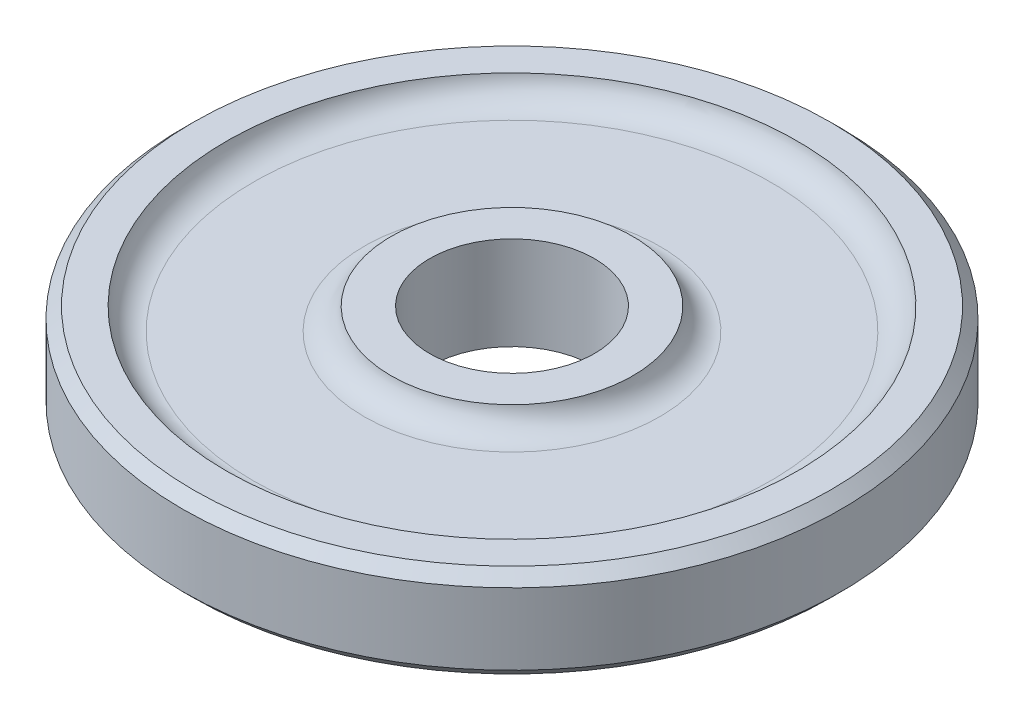
ISO-10303-21;
HEADER;
FILE_DESCRIPTION(('STEP AP214'),'2;1');
FILE_NAME('part.step','',(''),(''),'','','');
FILE_SCHEMA(('AUTOMOTIVE_DESIGN { 1 0 10303 214 1 1 1 1 }'));
ENDSEC;
DATA;
#1=APPLICATION_CONTEXT('core data for automotive mechanical design processes');
#2=APPLICATION_PROTOCOL_DEFINITION('international standard','automotive_design',2000,#1);
#3=PRODUCT_CONTEXT('',#1,'mechanical');
#4=PRODUCT('Part','Part','',(#3));
#5=PRODUCT_RELATED_PRODUCT_CATEGORY('part','',(#4));
#6=PRODUCT_DEFINITION_FORMATION('','',#4);
#7=PRODUCT_DEFINITION_CONTEXT('part definition',#1,'design');
#8=PRODUCT_DEFINITION('design','',#6,#7);
#9=PRODUCT_DEFINITION_SHAPE('','',#8);
#10=(LENGTH_UNIT() NAMED_UNIT(*) SI_UNIT(.MILLI.,.METRE.));
#11=(NAMED_UNIT(*) PLANE_ANGLE_UNIT() SI_UNIT($,.RADIAN.));
#12=(NAMED_UNIT(*) SI_UNIT($,.STERADIAN.) SOLID_ANGLE_UNIT());
#13=UNCERTAINTY_MEASURE_WITH_UNIT(LENGTH_MEASURE(1.E-05),#10,'distance_accuracy_value','');
#14=(GEOMETRIC_REPRESENTATION_CONTEXT(3) GLOBAL_UNCERTAINTY_ASSIGNED_CONTEXT((#13)) GLOBAL_UNIT_ASSIGNED_CONTEXT((#10,
#11,#12)) REPRESENTATION_CONTEXT('',''));
#15=CARTESIAN_POINT('',(0.,0.,0.));
#16=DIRECTION('',(0.,0.,1.));
#17=DIRECTION('',(1.,0.,0.));
#18=AXIS2_PLACEMENT_3D('',#15,#16,#17);
#19=CARTESIAN_POINT('',(0.,17.,0.));
#20=DIRECTION('',(0.,-1.,0.));
#21=DIRECTION('',(0.,0.,-1.));
#22=AXIS2_PLACEMENT_3D('',#19,#20,#21);
#23=CYLINDRICAL_SURFACE('',#22,60.);
#24=CARTESIAN_POINT('',(0.,1.99999999999999,0.));
#25=DIRECTION('',(0.,1.,0.));
#26=DIRECTION('',(0.,0.,1.));
#27=AXIS2_PLACEMENT_3D('',#24,#25,#26);
#28=CIRCLE('',#27,60.);
#29=CARTESIAN_POINT('',(0.,1.99999999999999,60.));
#30=VERTEX_POINT('',#29);
#31=EDGE_CURVE('E41',#30,#30,#28,.T.);
#32=ORIENTED_EDGE('',*,*,#31,.T.);
#33=EDGE_LOOP('',(#32));
#34=FACE_BOUND('',#33,.T.);
#35=CARTESIAN_POINT('',(0.,15.,0.));
#36=DIRECTION('',(0.,1.,0.));
#37=DIRECTION('',(0.,0.,1.));
#38=AXIS2_PLACEMENT_3D('',#35,#36,#37);
#39=CIRCLE('',#38,60.);
#40=CARTESIAN_POINT('',(0.,15.,60.));
#41=VERTEX_POINT('',#40);
#42=EDGE_CURVE('E45',#41,#41,#39,.F.);
#43=ORIENTED_EDGE('',*,*,#42,.T.);
#44=EDGE_LOOP('',(#43));
#45=FACE_BOUND('',#44,.T.);
#46=ADVANCED_FACE('F30',(#34,#45),#23,.T.);
#47=CARTESIAN_POINT('',(0.,17.,0.));
#48=DIRECTION('',(0.,1.,0.));
#49=DIRECTION('',(0.,0.,1.));
#50=AXIS2_PLACEMENT_3D('',#47,#48,#49);
#51=PLANE('',#50);
#52=CARTESIAN_POINT('',(0.,17.,0.));
#53=DIRECTION('',(0.,1.,0.));
#54=DIRECTION('',(0.,0.,1.));
#55=AXIS2_PLACEMENT_3D('',#52,#53,#54);
#56=CIRCLE('',#55,58.);
#57=CARTESIAN_POINT('',(0.,17.,58.));
#58=VERTEX_POINT('',#57);
#59=EDGE_CURVE('E10',#58,#58,#56,.T.);
#60=ORIENTED_EDGE('',*,*,#59,.T.);
#61=EDGE_LOOP('',(#60));
#62=FACE_BOUND('',#61,.T.);
#63=CARTESIAN_POINT('',(0.,17.,0.));
#64=DIRECTION('',(0.,1.,0.));
#65=DIRECTION('',(0.,0.,1.));
#66=AXIS2_PLACEMENT_3D('',#63,#64,#65);
#67=CIRCLE('',#66,52.);
#68=CARTESIAN_POINT('',(0.,17.,52.));
#69=VERTEX_POINT('',#68);
#70=EDGE_CURVE('E62',#69,#69,#67,.T.);
#71=ORIENTED_EDGE('',*,*,#70,.F.);
#72=EDGE_LOOP('',(#71));
#73=FACE_BOUND('',#72,.T.);
#74=ADVANCED_FACE('F114',(#62,#73),#51,.T.);
#75=CARTESIAN_POINT('',(0.,0.,0.));
#76=DIRECTION('',(0.,1.,0.));
#77=DIRECTION('',(0.,0.,1.));
#78=AXIS2_PLACEMENT_3D('',#75,#76,#77);
#79=PLANE('',#78);
#80=CARTESIAN_POINT('',(0.,0.,0.));
#81=DIRECTION('',(0.,1.,0.));
#82=DIRECTION('',(0.,0.,1.));
#83=AXIS2_PLACEMENT_3D('',#80,#81,#82);
#84=CIRCLE('',#83,58.);
#85=CARTESIAN_POINT('',(0.,0.,58.));
#86=VERTEX_POINT('',#85);
#87=EDGE_CURVE('E37',#86,#86,#84,.F.);
#88=ORIENTED_EDGE('',*,*,#87,.T.);
#89=EDGE_LOOP('',(#88));
#90=FACE_BOUND('',#89,.T.);
#91=CARTESIAN_POINT('',(0.,0.,0.));
#92=DIRECTION('',(0.,1.,0.));
#93=DIRECTION('',(0.,0.,1.));
#94=AXIS2_PLACEMENT_3D('',#91,#92,#93);
#95=CIRCLE('',#94,52.);
#96=CARTESIAN_POINT('',(0.,0.,52.));
#97=VERTEX_POINT('',#96);
#98=EDGE_CURVE('E68',#97,#97,#95,.T.);
#99=ORIENTED_EDGE('',*,*,#98,.T.);
#100=EDGE_LOOP('',(#99));
#101=FACE_BOUND('',#100,.T.);
#102=ADVANCED_FACE('F96',(#90,#101),#79,.F.);
#103=CARTESIAN_POINT('',(0.,13.,0.));
#104=DIRECTION('',(0.,1.,0.));
#105=DIRECTION('',(0.,0.,1.));
#106=AXIS2_PLACEMENT_3D('',#103,#104,#105);
#107=PLANE('',#106);
#108=CARTESIAN_POINT('',(0.,13.,0.));
#109=DIRECTION('',(0.,1.,0.));
#110=DIRECTION('',(0.,0.,1.));
#111=AXIS2_PLACEMENT_3D('',#108,#109,#110);
#112=CIRCLE('',#111,26.8989794855664);
#113=CARTESIAN_POINT('',(0.,13.,26.8989794855664));
#114=VERTEX_POINT('',#113);
#115=EDGE_CURVE('E50',#114,#114,#112,.F.);
#116=ORIENTED_EDGE('',*,*,#115,.T.);
#117=EDGE_LOOP('',(#116));
#118=FACE_BOUND('',#117,.T.);
#119=CARTESIAN_POINT('',(0.,13.,0.));
#120=DIRECTION('',(0.,1.,0.));
#121=DIRECTION('',(0.,0.,1.));
#122=AXIS2_PLACEMENT_3D('',#119,#120,#121);
#123=CIRCLE('',#122,47.1010205144336);
#124=CARTESIAN_POINT('',(0.,13.,47.1010205144336));
#125=VERTEX_POINT('',#124);
#126=EDGE_CURVE('E53',#125,#125,#123,.T.);
#127=ORIENTED_EDGE('',*,*,#126,.T.);
#128=EDGE_LOOP('',(#127));
#129=FACE_BOUND('',#128,.T.);
#130=ADVANCED_FACE('F112',(#118,#129),#107,.T.);
#131=CARTESIAN_POINT('',(0.,17.,0.));
#132=DIRECTION('',(0.,-1.,0.));
#133=DIRECTION('',(0.,0.,-1.));
#134=AXIS2_PLACEMENT_3D('',#131,#132,#133);
#135=CIRCLE('',#134,15.);
#136=CARTESIAN_POINT('',(0.,17.,-15.));
#137=VERTEX_POINT('',#136);
#138=EDGE_CURVE('E74',#137,#137,#135,.T.);
#139=ORIENTED_EDGE('',*,*,#138,.T.);
#140=EDGE_LOOP('',(#139));
#141=FACE_BOUND('',#140,.T.);
#142=CARTESIAN_POINT('',(0.,17.,0.));
#143=DIRECTION('',(0.,1.,0.));
#144=DIRECTION('',(0.,0.,1.));
#145=AXIS2_PLACEMENT_3D('',#142,#143,#144);
#146=CIRCLE('',#145,22.);
#147=CARTESIAN_POINT('',(0.,17.,22.));
#148=VERTEX_POINT('',#147);
#149=EDGE_CURVE('E65',#148,#148,#146,.T.);
#150=ORIENTED_EDGE('',*,*,#149,.T.);
#151=EDGE_LOOP('',(#150));
#152=FACE_BOUND('',#151,.T.);
#153=ADVANCED_FACE('F81',(#141,#152),#51,.T.);
#154=CARTESIAN_POINT('',(0.,4.,0.));
#155=DIRECTION('',(0.,-1.,0.));
#156=DIRECTION('',(0.,0.,1.));
#157=AXIS2_PLACEMENT_3D('',#154,#155,#156);
#158=PLANE('',#157);
#159=CARTESIAN_POINT('',(0.,4.,0.));
#160=DIRECTION('',(0.,-1.,0.));
#161=DIRECTION('',(0.,0.,-1.));
#162=AXIS2_PLACEMENT_3D('',#159,#160,#161);
#163=CIRCLE('',#162,47.1010205144336);
#164=CARTESIAN_POINT('',(0.,4.,-47.1010205144336));
#165=VERTEX_POINT('',#164);
#166=EDGE_CURVE('E56',#165,#165,#163,.T.);
#167=ORIENTED_EDGE('',*,*,#166,.T.);
#168=EDGE_LOOP('',(#167));
#169=FACE_BOUND('',#168,.T.);
#170=CARTESIAN_POINT('',(0.,4.,0.));
#171=DIRECTION('',(0.,-1.,0.));
#172=DIRECTION('',(0.,0.,-1.));
#173=AXIS2_PLACEMENT_3D('',#170,#171,#172);
#174=CIRCLE('',#173,26.8989794855664);
#175=CARTESIAN_POINT('',(0.,4.,-26.8989794855664));
#176=VERTEX_POINT('',#175);
#177=EDGE_CURVE('E59',#176,#176,#174,.F.);
#178=ORIENTED_EDGE('',*,*,#177,.T.);
#179=EDGE_LOOP('',(#178));
#180=FACE_BOUND('',#179,.T.);
#181=ADVANCED_FACE('F94',(#169,#180),#158,.T.);
#182=CARTESIAN_POINT('',(0.,0.,0.));
#183=DIRECTION('',(0.,-1.,0.));
#184=DIRECTION('',(0.,0.,-1.));
#185=AXIS2_PLACEMENT_3D('',#182,#183,#184);
#186=CIRCLE('',#185,15.);
#187=CARTESIAN_POINT('',(0.,0.,-15.));
#188=VERTEX_POINT('',#187);
#189=EDGE_CURVE('E75',#188,#188,#186,.T.);
#190=ORIENTED_EDGE('',*,*,#189,.F.);
#191=EDGE_LOOP('',(#190));
#192=FACE_BOUND('',#191,.T.);
#193=CARTESIAN_POINT('',(0.,0.,0.));
#194=DIRECTION('',(0.,1.,0.));
#195=DIRECTION('',(0.,0.,1.));
#196=AXIS2_PLACEMENT_3D('',#193,#194,#195);
#197=CIRCLE('',#196,22.);
#198=CARTESIAN_POINT('',(0.,0.,22.));
#199=VERTEX_POINT('',#198);
#200=EDGE_CURVE('E71',#199,#199,#197,.T.);
#201=ORIENTED_EDGE('',*,*,#200,.F.);
#202=EDGE_LOOP('',(#201));
#203=FACE_BOUND('',#202,.T.);
#204=ADVANCED_FACE('F90',(#192,#203),#79,.F.);
#205=CARTESIAN_POINT('',(0.,-1.,0.));
#206=DIRECTION('',(0.,1.,0.));
#207=DIRECTION('',(0.,0.,1.));
#208=AXIS2_PLACEMENT_3D('',#205,#206,#207);
#209=TOROIDAL_SURFACE('',#208,47.1010205144336,5.);
#210=ORIENTED_EDGE('',*,*,#166,.F.);
#211=EDGE_LOOP('',(#210));
#212=FACE_BOUND('',#211,.T.);
#213=ORIENTED_EDGE('',*,*,#98,.F.);
#214=EDGE_LOOP('',(#213));
#215=FACE_BOUND('',#214,.T.);
#216=ADVANCED_FACE('F93',(#212,#215),#209,.F.);
#217=CARTESIAN_POINT('',(0.,-1.,0.));
#218=DIRECTION('',(0.,-1.,0.));
#219=DIRECTION('',(0.,0.,-1.));
#220=AXIS2_PLACEMENT_3D('',#217,#218,#219);
#221=TOROIDAL_SURFACE('',#220,26.8989794855664,5.);
#222=ORIENTED_EDGE('',*,*,#200,.T.);
#223=EDGE_LOOP('',(#222));
#224=FACE_BOUND('',#223,.T.);
#225=ORIENTED_EDGE('',*,*,#177,.F.);
#226=EDGE_LOOP('',(#225));
#227=FACE_BOUND('',#226,.T.);
#228=ADVANCED_FACE('F99',(#224,#227),#221,.F.);
#229=CARTESIAN_POINT('',(0.,18.,0.));
#230=DIRECTION('',(0.,1.,0.));
#231=DIRECTION('',(0.,0.,1.));
#232=AXIS2_PLACEMENT_3D('',#229,#230,#231);
#233=TOROIDAL_SURFACE('',#232,26.8989794855664,5.);
#234=ORIENTED_EDGE('',*,*,#115,.F.);
#235=EDGE_LOOP('',(#234));
#236=FACE_BOUND('',#235,.T.);
#237=ORIENTED_EDGE('',*,*,#149,.F.);
#238=EDGE_LOOP('',(#237));
#239=FACE_BOUND('',#238,.T.);
#240=ADVANCED_FACE('F102',(#236,#239),#233,.F.);
#241=CARTESIAN_POINT('',(0.,18.,0.));
#242=DIRECTION('',(0.,-1.,0.));
#243=DIRECTION('',(0.,0.,-1.));
#244=AXIS2_PLACEMENT_3D('',#241,#242,#243);
#245=TOROIDAL_SURFACE('',#244,47.1010205144336,5.);
#246=ORIENTED_EDGE('',*,*,#70,.T.);
#247=EDGE_LOOP('',(#246));
#248=FACE_BOUND('',#247,.T.);
#249=ORIENTED_EDGE('',*,*,#126,.F.);
#250=EDGE_LOOP('',(#249));
#251=FACE_BOUND('',#250,.T.);
#252=ADVANCED_FACE('F129',(#248,#251),#245,.F.);
#253=CARTESIAN_POINT('',(0.,1.99999999999999,0.));
#254=DIRECTION('',(0.,1.,0.));
#255=DIRECTION('',(0.,0.,1.));
#256=AXIS2_PLACEMENT_3D('',#253,#254,#255);
#257=CONICAL_SURFACE('',#256,60.,0.785398163397452);
#258=ORIENTED_EDGE('',*,*,#87,.F.);
#259=EDGE_LOOP('',(#258));
#260=FACE_BOUND('',#259,.T.);
#261=ORIENTED_EDGE('',*,*,#31,.F.);
#262=EDGE_LOOP('',(#261));
#263=FACE_BOUND('',#262,.T.);
#264=ADVANCED_FACE('F132',(#260,#263),#257,.T.);
#265=CARTESIAN_POINT('',(0.,17.,0.));
#266=DIRECTION('',(0.,-1.,0.));
#267=DIRECTION('',(0.,0.,-1.));
#268=AXIS2_PLACEMENT_3D('',#265,#266,#267);
#269=CONICAL_SURFACE('',#268,58.,0.785398163397447);
#270=ORIENTED_EDGE('',*,*,#42,.F.);
#271=EDGE_LOOP('',(#270));
#272=FACE_BOUND('',#271,.T.);
#273=ORIENTED_EDGE('',*,*,#59,.F.);
#274=EDGE_LOOP('',(#273));
#275=FACE_BOUND('',#274,.T.);
#276=ADVANCED_FACE('F32',(#272,#275),#269,.T.);
#277=CARTESIAN_POINT('',(0.,17.,0.));
#278=DIRECTION('',(0.,-1.,0.));
#279=DIRECTION('',(0.,0.,-1.));
#280=AXIS2_PLACEMENT_3D('',#277,#278,#279);
#281=CYLINDRICAL_SURFACE('',#280,15.);
#282=ORIENTED_EDGE('',*,*,#138,.F.);
#283=EDGE_LOOP('',(#282));
#284=FACE_BOUND('',#283,.T.);
#285=ORIENTED_EDGE('',*,*,#189,.T.);
#286=EDGE_LOOP('',(#285));
#287=FACE_BOUND('',#286,.T.);
#288=ADVANCED_FACE('F84',(#284,#287),#281,.F.);
#289=CLOSED_SHELL('',(#46,#74,#102,#130,#153,#181,#204,#216,#228,#240,#252,#264,#276,#288));
#290=MANIFOLD_SOLID_BREP('B2',#289);
#291=ADVANCED_BREP_SHAPE_REPRESENTATION('',(#18,#290),#14);
#292=SHAPE_DEFINITION_REPRESENTATION(#9,#291);
ENDSEC;
END-ISO-10303-21;
